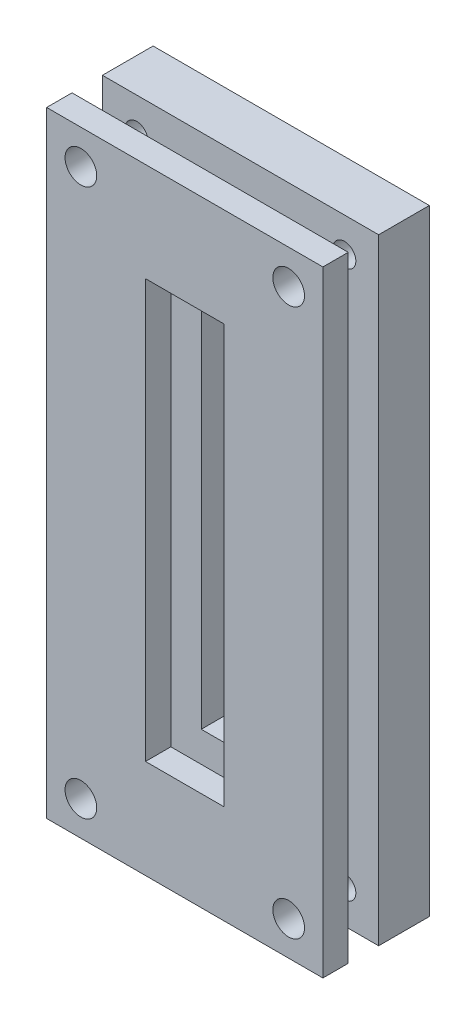
ISO-10303-21;
HEADER;
FILE_DESCRIPTION(('STEP AP214'),'2;1');
FILE_NAME('part.step','',(''),(''),'','','');
FILE_SCHEMA(('AUTOMOTIVE_DESIGN { 1 0 10303 214 1 1 1 1 }'));
ENDSEC;
DATA;
#1=APPLICATION_CONTEXT('core data for automotive mechanical design processes');
#2=APPLICATION_PROTOCOL_DEFINITION('international standard','automotive_design',2000,#1);
#3=PRODUCT_CONTEXT('',#1,'mechanical');
#4=PRODUCT('Part','Part','',(#3));
#5=PRODUCT_RELATED_PRODUCT_CATEGORY('part','',(#4));
#6=PRODUCT_DEFINITION_FORMATION('','',#4);
#7=PRODUCT_DEFINITION_CONTEXT('part definition',#1,'design');
#8=PRODUCT_DEFINITION('design','',#6,#7);
#9=PRODUCT_DEFINITION_SHAPE('','',#8);
#10=(LENGTH_UNIT() NAMED_UNIT(*) SI_UNIT(.MILLI.,.METRE.));
#11=(NAMED_UNIT(*) PLANE_ANGLE_UNIT() SI_UNIT($,.RADIAN.));
#12=(NAMED_UNIT(*) SI_UNIT($,.STERADIAN.) SOLID_ANGLE_UNIT());
#13=UNCERTAINTY_MEASURE_WITH_UNIT(LENGTH_MEASURE(1.E-05),#10,'distance_accuracy_value','');
#14=(GEOMETRIC_REPRESENTATION_CONTEXT(3) GLOBAL_UNCERTAINTY_ASSIGNED_CONTEXT((#13)) GLOBAL_UNIT_ASSIGNED_CONTEXT((#10,
#11,#12)) REPRESENTATION_CONTEXT('',''));
#15=CARTESIAN_POINT('',(0.,0.,0.));
#16=DIRECTION('',(0.,0.,1.));
#17=DIRECTION('',(1.,0.,0.));
#18=AXIS2_PLACEMENT_3D('',#15,#16,#17);
#19=CARTESIAN_POINT('',(0.,0.,8.9));
#20=DIRECTION('',(0.,0.,1.));
#21=DIRECTION('',(1.,0.,0.));
#22=AXIS2_PLACEMENT_3D('',#19,#20,#21);
#23=PLANE('',#22);
#24=CARTESIAN_POINT('',(-8.20000000000001,-21.6,8.9));
#25=DIRECTION('',(0.,0.,1.));
#26=DIRECTION('',(1.,0.,0.));
#27=AXIS2_PLACEMENT_3D('',#24,#25,#26);
#28=CIRCLE('',#27,1.25);
#29=CARTESIAN_POINT('',(-6.95000000000001,-21.6,8.9));
#30=VERTEX_POINT('',#29);
#31=EDGE_CURVE('E261',#30,#30,#28,.T.);
#32=ORIENTED_EDGE('',*,*,#31,.F.);
#33=EDGE_LOOP('',(#32));
#34=FACE_BOUND('',#33,.T.);
#35=CARTESIAN_POINT('',(-8.2,21.6,8.9));
#36=DIRECTION('',(0.,0.,1.));
#37=DIRECTION('',(1.,0.,0.));
#38=AXIS2_PLACEMENT_3D('',#35,#36,#37);
#39=CIRCLE('',#38,1.25);
#40=CARTESIAN_POINT('',(-6.95,21.6,8.9));
#41=VERTEX_POINT('',#40);
#42=EDGE_CURVE('E143',#41,#41,#39,.T.);
#43=ORIENTED_EDGE('',*,*,#42,.F.);
#44=EDGE_LOOP('',(#43));
#45=FACE_BOUND('',#44,.T.);
#46=DIRECTION('',(0.,-1.,0.));
#47=VECTOR('',#46,1.);
#48=CARTESIAN_POINT('',(-10.9,24.3,8.9));
#49=LINE('',#48,#47);
#50=CARTESIAN_POINT('',(-10.9,24.3,8.9));
#51=VERTEX_POINT('',#50);
#52=CARTESIAN_POINT('',(-10.9,-24.3,8.9));
#53=VERTEX_POINT('',#52);
#54=EDGE_CURVE('E153',#51,#53,#49,.T.);
#55=ORIENTED_EDGE('',*,*,#54,.T.);
#56=DIRECTION('',(1.,0.,0.));
#57=VECTOR('',#56,1.);
#58=CARTESIAN_POINT('',(-10.9,-24.3,8.9));
#59=LINE('',#58,#57);
#60=CARTESIAN_POINT('',(10.9,-24.3,8.9));
#61=VERTEX_POINT('',#60);
#62=EDGE_CURVE('E156',#53,#61,#59,.T.);
#63=ORIENTED_EDGE('',*,*,#62,.T.);
#64=DIRECTION('',(0.,1.,0.));
#65=VECTOR('',#64,1.);
#66=CARTESIAN_POINT('',(10.9,-24.3,8.9));
#67=LINE('',#66,#65);
#68=CARTESIAN_POINT('',(10.9,24.3,8.9));
#69=VERTEX_POINT('',#68);
#70=EDGE_CURVE('E159',#61,#69,#67,.T.);
#71=ORIENTED_EDGE('',*,*,#70,.T.);
#72=DIRECTION('',(-1.,0.,0.));
#73=VECTOR('',#72,1.);
#74=CARTESIAN_POINT('',(10.9,24.3,8.9));
#75=LINE('',#74,#73);
#76=EDGE_CURVE('E161',#69,#51,#75,.T.);
#77=ORIENTED_EDGE('',*,*,#76,.T.);
#78=EDGE_LOOP('',(#55,#63,#71,#77));
#79=FACE_BOUND('',#78,.T.);
#80=DIRECTION('',(0.,-1.,0.));
#81=VECTOR('',#80,1.);
#82=CARTESIAN_POINT('',(-3.1,16.5,8.9));
#83=LINE('',#82,#81);
#84=CARTESIAN_POINT('',(-3.1,16.5,8.9));
#85=VERTEX_POINT('',#84);
#86=CARTESIAN_POINT('',(-3.1,-16.5,8.9));
#87=VERTEX_POINT('',#86);
#88=EDGE_CURVE('E122',#85,#87,#83,.T.);
#89=ORIENTED_EDGE('',*,*,#88,.F.);
#90=DIRECTION('',(-1.,0.,0.));
#91=VECTOR('',#90,1.);
#92=CARTESIAN_POINT('',(3.1,16.5,8.9));
#93=LINE('',#92,#91);
#94=CARTESIAN_POINT('',(3.1,16.5,8.9));
#95=VERTEX_POINT('',#94);
#96=EDGE_CURVE('E114',#95,#85,#93,.T.);
#97=ORIENTED_EDGE('',*,*,#96,.F.);
#98=DIRECTION('',(0.,1.,0.));
#99=VECTOR('',#98,1.);
#100=CARTESIAN_POINT('',(3.1,-16.5,8.9));
#101=LINE('',#100,#99);
#102=CARTESIAN_POINT('',(3.1,-16.5,8.9));
#103=VERTEX_POINT('',#102);
#104=EDGE_CURVE('E137',#103,#95,#101,.T.);
#105=ORIENTED_EDGE('',*,*,#104,.F.);
#106=DIRECTION('',(1.,0.,0.));
#107=VECTOR('',#106,1.);
#108=CARTESIAN_POINT('',(-3.1,-16.5,8.9));
#109=LINE('',#108,#107);
#110=EDGE_CURVE('E135',#87,#103,#109,.T.);
#111=ORIENTED_EDGE('',*,*,#110,.F.);
#112=EDGE_LOOP('',(#89,#97,#105,#111));
#113=FACE_BOUND('',#112,.T.);
#114=CARTESIAN_POINT('',(8.2,21.6,8.9));
#115=DIRECTION('',(0.,0.,1.));
#116=DIRECTION('',(1.,0.,0.));
#117=AXIS2_PLACEMENT_3D('',#114,#115,#116);
#118=CIRCLE('',#117,1.25);
#119=CARTESIAN_POINT('',(9.45,21.6,8.9));
#120=VERTEX_POINT('',#119);
#121=EDGE_CURVE('E267',#120,#120,#118,.T.);
#122=ORIENTED_EDGE('',*,*,#121,.F.);
#123=EDGE_LOOP('',(#122));
#124=FACE_BOUND('',#123,.T.);
#125=CARTESIAN_POINT('',(8.19999999999999,-21.6,8.9));
#126=DIRECTION('',(0.,0.,1.));
#127=DIRECTION('',(1.,0.,0.));
#128=AXIS2_PLACEMENT_3D('',#125,#126,#127);
#129=CIRCLE('',#128,1.25);
#130=CARTESIAN_POINT('',(9.44999999999999,-21.6,8.9));
#131=VERTEX_POINT('',#130);
#132=EDGE_CURVE('E252',#131,#131,#129,.T.);
#133=ORIENTED_EDGE('',*,*,#132,.F.);
#134=EDGE_LOOP('',(#133));
#135=FACE_BOUND('',#134,.T.);
#136=ADVANCED_FACE('F49',(#34,#45,#79,#113,#124,#135),#23,.T.);
#137=CARTESIAN_POINT('',(0.,0.,6.9));
#138=DIRECTION('',(0.,0.,1.));
#139=DIRECTION('',(1.,0.,0.));
#140=AXIS2_PLACEMENT_3D('',#137,#138,#139);
#141=PLANE('',#140);
#142=DIRECTION('',(0.,-1.,0.));
#143=VECTOR('',#142,1.);
#144=CARTESIAN_POINT('',(-10.9,24.3,6.9));
#145=LINE('',#144,#143);
#146=CARTESIAN_POINT('',(-10.9,24.3,6.9));
#147=VERTEX_POINT('',#146);
#148=CARTESIAN_POINT('',(-10.9,-24.3,6.9));
#149=VERTEX_POINT('',#148);
#150=EDGE_CURVE('E130',#147,#149,#145,.T.);
#151=ORIENTED_EDGE('',*,*,#150,.F.);
#152=DIRECTION('',(-1.,0.,0.));
#153=VECTOR('',#152,1.);
#154=CARTESIAN_POINT('',(10.9,24.3,6.9));
#155=LINE('',#154,#153);
#156=CARTESIAN_POINT('',(10.9,24.3,6.9));
#157=VERTEX_POINT('',#156);
#158=EDGE_CURVE('E157',#157,#147,#155,.T.);
#159=ORIENTED_EDGE('',*,*,#158,.F.);
#160=DIRECTION('',(0.,1.,0.));
#161=VECTOR('',#160,1.);
#162=CARTESIAN_POINT('',(10.9,-24.3,6.9));
#163=LINE('',#162,#161);
#164=CARTESIAN_POINT('',(10.9,-24.3,6.9));
#165=VERTEX_POINT('',#164);
#166=EDGE_CURVE('E168',#165,#157,#163,.T.);
#167=ORIENTED_EDGE('',*,*,#166,.F.);
#168=DIRECTION('',(1.,0.,0.));
#169=VECTOR('',#168,1.);
#170=CARTESIAN_POINT('',(-10.9,-24.3,6.9));
#171=LINE('',#170,#169);
#172=EDGE_CURVE('E166',#149,#165,#171,.T.);
#173=ORIENTED_EDGE('',*,*,#172,.F.);
#174=EDGE_LOOP('',(#151,#159,#167,#173));
#175=FACE_BOUND('',#174,.T.);
#176=DIRECTION('',(-1.,0.,0.));
#177=VECTOR('',#176,1.);
#178=CARTESIAN_POINT('',(3.1,16.5,6.9));
#179=LINE('',#178,#177);
#180=CARTESIAN_POINT('',(3.1,16.5,6.9));
#181=VERTEX_POINT('',#180);
#182=CARTESIAN_POINT('',(-3.1,16.5,6.9));
#183=VERTEX_POINT('',#182);
#184=EDGE_CURVE('E72',#181,#183,#179,.T.);
#185=ORIENTED_EDGE('',*,*,#184,.T.);
#186=DIRECTION('',(0.,-1.,0.));
#187=VECTOR('',#186,1.);
#188=CARTESIAN_POINT('',(-3.1,16.5,6.9));
#189=LINE('',#188,#187);
#190=CARTESIAN_POINT('',(-3.1,-16.5,6.9));
#191=VERTEX_POINT('',#190);
#192=EDGE_CURVE('E129',#183,#191,#189,.T.);
#193=ORIENTED_EDGE('',*,*,#192,.T.);
#194=DIRECTION('',(1.,0.,0.));
#195=VECTOR('',#194,1.);
#196=CARTESIAN_POINT('',(-3.1,-16.5,6.9));
#197=LINE('',#196,#195);
#198=CARTESIAN_POINT('',(3.1,-16.5,6.9));
#199=VERTEX_POINT('',#198);
#200=EDGE_CURVE('E145',#191,#199,#197,.T.);
#201=ORIENTED_EDGE('',*,*,#200,.T.);
#202=DIRECTION('',(0.,1.,0.));
#203=VECTOR('',#202,1.);
#204=CARTESIAN_POINT('',(3.1,-16.5,6.9));
#205=LINE('',#204,#203);
#206=EDGE_CURVE('E123',#199,#181,#205,.T.);
#207=ORIENTED_EDGE('',*,*,#206,.T.);
#208=EDGE_LOOP('',(#185,#193,#201,#207));
#209=FACE_BOUND('',#208,.T.);
#210=CARTESIAN_POINT('',(-8.2,21.6,6.9));
#211=DIRECTION('',(0.,0.,1.));
#212=DIRECTION('',(1.,0.,0.));
#213=AXIS2_PLACEMENT_3D('',#210,#211,#212);
#214=CIRCLE('',#213,1.25);
#215=CARTESIAN_POINT('',(-6.95,21.6,6.9));
#216=VERTEX_POINT('',#215);
#217=EDGE_CURVE('E270',#216,#216,#214,.T.);
#218=ORIENTED_EDGE('',*,*,#217,.T.);
#219=EDGE_LOOP('',(#218));
#220=FACE_BOUND('',#219,.T.);
#221=CARTESIAN_POINT('',(8.2,21.6,6.9));
#222=DIRECTION('',(0.,0.,1.));
#223=DIRECTION('',(1.,0.,0.));
#224=AXIS2_PLACEMENT_3D('',#221,#222,#223);
#225=CIRCLE('',#224,1.25);
#226=CARTESIAN_POINT('',(9.45,21.6,6.9));
#227=VERTEX_POINT('',#226);
#228=EDGE_CURVE('E264',#227,#227,#225,.T.);
#229=ORIENTED_EDGE('',*,*,#228,.T.);
#230=EDGE_LOOP('',(#229));
#231=FACE_BOUND('',#230,.T.);
#232=CARTESIAN_POINT('',(-8.20000000000001,-21.6,6.9));
#233=DIRECTION('',(0.,0.,1.));
#234=DIRECTION('',(1.,0.,0.));
#235=AXIS2_PLACEMENT_3D('',#232,#233,#234);
#236=CIRCLE('',#235,1.25);
#237=CARTESIAN_POINT('',(-6.95000000000001,-21.6,6.9));
#238=VERTEX_POINT('',#237);
#239=EDGE_CURVE('E258',#238,#238,#236,.T.);
#240=ORIENTED_EDGE('',*,*,#239,.T.);
#241=EDGE_LOOP('',(#240));
#242=FACE_BOUND('',#241,.T.);
#243=CARTESIAN_POINT('',(8.19999999999999,-21.6,6.9));
#244=DIRECTION('',(0.,0.,1.));
#245=DIRECTION('',(1.,0.,0.));
#246=AXIS2_PLACEMENT_3D('',#243,#244,#245);
#247=CIRCLE('',#246,1.25);
#248=CARTESIAN_POINT('',(9.44999999999999,-21.6,6.9));
#249=VERTEX_POINT('',#248);
#250=EDGE_CURVE('E255',#249,#249,#247,.T.);
#251=ORIENTED_EDGE('',*,*,#250,.T.);
#252=EDGE_LOOP('',(#251));
#253=FACE_BOUND('',#252,.T.);
#254=ADVANCED_FACE('F186',(#175,#209,#220,#231,#242,#253),#141,.F.);
#255=CARTESIAN_POINT('',(-10.9,24.3,8.9));
#256=DIRECTION('',(1.,0.,0.));
#257=DIRECTION('',(0.,1.,0.));
#258=AXIS2_PLACEMENT_3D('',#255,#256,#257);
#259=PLANE('',#258);
#260=ORIENTED_EDGE('',*,*,#150,.T.);
#261=DIRECTION('',(0.,0.,-1.));
#262=VECTOR('',#261,1.);
#263=CARTESIAN_POINT('',(-10.9,-24.3,8.9));
#264=LINE('',#263,#262);
#265=EDGE_CURVE('E12',#53,#149,#264,.T.);
#266=ORIENTED_EDGE('',*,*,#265,.F.);
#267=ORIENTED_EDGE('',*,*,#54,.F.);
#268=DIRECTION('',(0.,0.,-1.));
#269=VECTOR('',#268,1.);
#270=CARTESIAN_POINT('',(-10.9,24.3,8.9));
#271=LINE('',#270,#269);
#272=EDGE_CURVE('E163',#51,#147,#271,.T.);
#273=ORIENTED_EDGE('',*,*,#272,.T.);
#274=EDGE_LOOP('',(#260,#266,#267,#273));
#275=FACE_BOUND('',#274,.T.);
#276=ADVANCED_FACE('F51',(#275),#259,.F.);
#277=CARTESIAN_POINT('',(-10.9,-24.3,8.9));
#278=DIRECTION('',(0.,1.,0.));
#279=DIRECTION('',(0.,0.,1.));
#280=AXIS2_PLACEMENT_3D('',#277,#278,#279);
#281=PLANE('',#280);
#282=ORIENTED_EDGE('',*,*,#172,.T.);
#283=DIRECTION('',(0.,0.,-1.));
#284=VECTOR('',#283,1.);
#285=CARTESIAN_POINT('',(10.9,-24.3,8.9));
#286=LINE('',#285,#284);
#287=EDGE_CURVE('E57',#61,#165,#286,.T.);
#288=ORIENTED_EDGE('',*,*,#287,.F.);
#289=ORIENTED_EDGE('',*,*,#62,.F.);
#290=ORIENTED_EDGE('',*,*,#265,.T.);
#291=EDGE_LOOP('',(#282,#288,#289,#290));
#292=FACE_BOUND('',#291,.T.);
#293=ADVANCED_FACE('F196',(#292),#281,.F.);
#294=CARTESIAN_POINT('',(10.9,-24.3,8.9));
#295=DIRECTION('',(-1.,0.,0.));
#296=DIRECTION('',(0.,0.,1.));
#297=AXIS2_PLACEMENT_3D('',#294,#295,#296);
#298=PLANE('',#297);
#299=ORIENTED_EDGE('',*,*,#166,.T.);
#300=DIRECTION('',(0.,0.,-1.));
#301=VECTOR('',#300,1.);
#302=CARTESIAN_POINT('',(10.9,24.3,8.9));
#303=LINE('',#302,#301);
#304=EDGE_CURVE('E173',#69,#157,#303,.T.);
#305=ORIENTED_EDGE('',*,*,#304,.F.);
#306=ORIENTED_EDGE('',*,*,#70,.F.);
#307=ORIENTED_EDGE('',*,*,#287,.T.);
#308=EDGE_LOOP('',(#299,#305,#306,#307));
#309=FACE_BOUND('',#308,.T.);
#310=ADVANCED_FACE('F180',(#309),#298,.F.);
#311=CARTESIAN_POINT('',(10.9,24.3,8.9));
#312=DIRECTION('',(0.,-1.,0.));
#313=DIRECTION('',(1.,0.,0.));
#314=AXIS2_PLACEMENT_3D('',#311,#312,#313);
#315=PLANE('',#314);
#316=ORIENTED_EDGE('',*,*,#158,.T.);
#317=ORIENTED_EDGE('',*,*,#272,.F.);
#318=ORIENTED_EDGE('',*,*,#76,.F.);
#319=ORIENTED_EDGE('',*,*,#304,.T.);
#320=EDGE_LOOP('',(#316,#317,#318,#319));
#321=FACE_BOUND('',#320,.T.);
#322=ADVANCED_FACE('F190',(#321),#315,.F.);
#323=CARTESIAN_POINT('',(3.1,16.5,8.9));
#324=DIRECTION('',(0.,-1.,0.));
#325=DIRECTION('',(0.,0.,-1.));
#326=AXIS2_PLACEMENT_3D('',#323,#324,#325);
#327=PLANE('',#326);
#328=ORIENTED_EDGE('',*,*,#184,.F.);
#329=DIRECTION('',(0.,0.,-1.));
#330=VECTOR('',#329,1.);
#331=CARTESIAN_POINT('',(3.1,16.5,8.9));
#332=LINE('',#331,#330);
#333=EDGE_CURVE('E118',#95,#181,#332,.T.);
#334=ORIENTED_EDGE('',*,*,#333,.F.);
#335=ORIENTED_EDGE('',*,*,#96,.T.);
#336=DIRECTION('',(0.,0.,-1.));
#337=VECTOR('',#336,1.);
#338=CARTESIAN_POINT('',(-3.1,16.5,8.9));
#339=LINE('',#338,#337);
#340=EDGE_CURVE('E117',#85,#183,#339,.T.);
#341=ORIENTED_EDGE('',*,*,#340,.T.);
#342=EDGE_LOOP('',(#328,#334,#335,#341));
#343=FACE_BOUND('',#342,.T.);
#344=ADVANCED_FACE('F116',(#343),#327,.T.);
#345=CARTESIAN_POINT('',(-3.1,16.5,8.9));
#346=DIRECTION('',(1.,0.,0.));
#347=DIRECTION('',(0.,1.,0.));
#348=AXIS2_PLACEMENT_3D('',#345,#346,#347);
#349=PLANE('',#348);
#350=ORIENTED_EDGE('',*,*,#192,.F.);
#351=ORIENTED_EDGE('',*,*,#340,.F.);
#352=ORIENTED_EDGE('',*,*,#88,.T.);
#353=DIRECTION('',(0.,0.,-1.));
#354=VECTOR('',#353,1.);
#355=CARTESIAN_POINT('',(-3.1,-16.5,8.9));
#356=LINE('',#355,#354);
#357=EDGE_CURVE('E131',#87,#191,#356,.T.);
#358=ORIENTED_EDGE('',*,*,#357,.T.);
#359=EDGE_LOOP('',(#350,#351,#352,#358));
#360=FACE_BOUND('',#359,.T.);
#361=ADVANCED_FACE('F126',(#360),#349,.T.);
#362=CARTESIAN_POINT('',(-3.1,-16.5,8.9));
#363=DIRECTION('',(0.,1.,0.));
#364=DIRECTION('',(0.,0.,1.));
#365=AXIS2_PLACEMENT_3D('',#362,#363,#364);
#366=PLANE('',#365);
#367=ORIENTED_EDGE('',*,*,#200,.F.);
#368=ORIENTED_EDGE('',*,*,#357,.F.);
#369=ORIENTED_EDGE('',*,*,#110,.T.);
#370=DIRECTION('',(0.,0.,-1.));
#371=VECTOR('',#370,1.);
#372=CARTESIAN_POINT('',(3.1,-16.5,8.9));
#373=LINE('',#372,#371);
#374=EDGE_CURVE('E64',#103,#199,#373,.T.);
#375=ORIENTED_EDGE('',*,*,#374,.T.);
#376=EDGE_LOOP('',(#367,#368,#369,#375));
#377=FACE_BOUND('',#376,.T.);
#378=ADVANCED_FACE('F222',(#377),#366,.T.);
#379=CARTESIAN_POINT('',(3.1,-16.5,8.9));
#380=DIRECTION('',(-1.,0.,0.));
#381=DIRECTION('',(0.,-1.,0.));
#382=AXIS2_PLACEMENT_3D('',#379,#380,#381);
#383=PLANE('',#382);
#384=ORIENTED_EDGE('',*,*,#206,.F.);
#385=ORIENTED_EDGE('',*,*,#374,.F.);
#386=ORIENTED_EDGE('',*,*,#104,.T.);
#387=ORIENTED_EDGE('',*,*,#333,.T.);
#388=EDGE_LOOP('',(#384,#385,#386,#387));
#389=FACE_BOUND('',#388,.T.);
#390=ADVANCED_FACE('F226',(#389),#383,.T.);
#391=CARTESIAN_POINT('',(-8.2,21.6,8.9));
#392=DIRECTION('',(0.,0.,-1.));
#393=DIRECTION('',(-1.,0.,0.));
#394=AXIS2_PLACEMENT_3D('',#391,#392,#393);
#395=CYLINDRICAL_SURFACE('',#394,1.25);
#396=ORIENTED_EDGE('',*,*,#42,.T.);
#397=EDGE_LOOP('',(#396));
#398=FACE_BOUND('',#397,.T.);
#399=ORIENTED_EDGE('',*,*,#217,.F.);
#400=EDGE_LOOP('',(#399));
#401=FACE_BOUND('',#400,.T.);
#402=ADVANCED_FACE('F232',(#398,#401),#395,.F.);
#403=CARTESIAN_POINT('',(8.2,21.6,8.9));
#404=DIRECTION('',(0.,0.,-1.));
#405=DIRECTION('',(-1.,0.,0.));
#406=AXIS2_PLACEMENT_3D('',#403,#404,#405);
#407=CYLINDRICAL_SURFACE('',#406,1.25);
#408=ORIENTED_EDGE('',*,*,#121,.T.);
#409=EDGE_LOOP('',(#408));
#410=FACE_BOUND('',#409,.T.);
#411=ORIENTED_EDGE('',*,*,#228,.F.);
#412=EDGE_LOOP('',(#411));
#413=FACE_BOUND('',#412,.T.);
#414=ADVANCED_FACE('F235',(#410,#413),#407,.F.);
#415=CARTESIAN_POINT('',(-8.20000000000001,-21.6,8.9));
#416=DIRECTION('',(0.,0.,-1.));
#417=DIRECTION('',(-1.,0.,0.));
#418=AXIS2_PLACEMENT_3D('',#415,#416,#417);
#419=CYLINDRICAL_SURFACE('',#418,1.25);
#420=ORIENTED_EDGE('',*,*,#31,.T.);
#421=EDGE_LOOP('',(#420));
#422=FACE_BOUND('',#421,.T.);
#423=ORIENTED_EDGE('',*,*,#239,.F.);
#424=EDGE_LOOP('',(#423));
#425=FACE_BOUND('',#424,.T.);
#426=ADVANCED_FACE('F239',(#422,#425),#419,.F.);
#427=CARTESIAN_POINT('',(8.19999999999999,-21.6,8.9));
#428=DIRECTION('',(0.,0.,-1.));
#429=DIRECTION('',(-1.,0.,0.));
#430=AXIS2_PLACEMENT_3D('',#427,#428,#429);
#431=CYLINDRICAL_SURFACE('',#430,1.25);
#432=ORIENTED_EDGE('',*,*,#132,.T.);
#433=EDGE_LOOP('',(#432));
#434=FACE_BOUND('',#433,.T.);
#435=ORIENTED_EDGE('',*,*,#250,.F.);
#436=EDGE_LOOP('',(#435));
#437=FACE_BOUND('',#436,.T.);
#438=ADVANCED_FACE('F243',(#434,#437),#431,.F.);
#439=CLOSED_SHELL('',(#136,#254,#276,#293,#310,#322,#344,#361,#378,#390,#402,#414,#426,#438));
#440=MANIFOLD_SOLID_BREP('B2',#439);
#441=CARTESIAN_POINT('',(5.5,16.5,4.5));
#442=DIRECTION('',(-1.,0.,0.));
#443=DIRECTION('',(0.,-1.,0.));
#444=AXIS2_PLACEMENT_3D('',#441,#442,#443);
#445=PLANE('',#444);
#446=DIRECTION('',(0.,1.,0.));
#447=VECTOR('',#446,1.);
#448=CARTESIAN_POINT('',(5.5,-18.9,0.5));
#449=LINE('',#448,#447);
#450=CARTESIAN_POINT('',(5.5,-18.9,0.5));
#451=VERTEX_POINT('',#450);
#452=CARTESIAN_POINT('',(5.5,18.9,0.5));
#453=VERTEX_POINT('',#452);
#454=EDGE_CURVE('E467',#451,#453,#449,.T.);
#455=ORIENTED_EDGE('',*,*,#454,.F.);
#456=DIRECTION('',(0.,0.,-1.));
#457=VECTOR('',#456,1.);
#458=CARTESIAN_POINT('',(5.5,-18.9,4.5));
#459=LINE('',#458,#457);
#460=CARTESIAN_POINT('',(5.5,-18.9,0.));
#461=VERTEX_POINT('',#460);
#462=EDGE_CURVE('E454',#451,#461,#459,.T.);
#463=ORIENTED_EDGE('',*,*,#462,.T.);
#464=DIRECTION('',(0.,1.,0.));
#465=VECTOR('',#464,1.);
#466=CARTESIAN_POINT('',(5.5,16.5,0.));
#467=LINE('',#466,#465);
#468=CARTESIAN_POINT('',(5.5,18.9,0.));
#469=VERTEX_POINT('',#468);
#470=EDGE_CURVE('E572',#461,#469,#467,.T.);
#471=ORIENTED_EDGE('',*,*,#470,.T.);
#472=DIRECTION('',(0.,0.,-1.));
#473=VECTOR('',#472,1.);
#474=CARTESIAN_POINT('',(5.5,18.9,4.5));
#475=LINE('',#474,#473);
#476=EDGE_CURVE('E47',#453,#469,#475,.T.);
#477=ORIENTED_EDGE('',*,*,#476,.F.);
#478=EDGE_LOOP('',(#455,#463,#471,#477));
#479=FACE_BOUND('',#478,.T.);
#480=ADVANCED_FACE('F363',(#479),#445,.F.);
#481=CARTESIAN_POINT('',(-3.1,18.9,4.5));
#482=DIRECTION('',(0.,-1.,0.));
#483=DIRECTION('',(0.,0.,-1.));
#484=AXIS2_PLACEMENT_3D('',#481,#482,#483);
#485=PLANE('',#484);
#486=DIRECTION('',(-1.,0.,0.));
#487=VECTOR('',#486,1.);
#488=CARTESIAN_POINT('',(5.5,18.9,0.5));
#489=LINE('',#488,#487);
#490=CARTESIAN_POINT('',(-5.5,18.9,0.5));
#491=VERTEX_POINT('',#490);
#492=EDGE_CURVE('E380',#453,#491,#489,.T.);
#493=ORIENTED_EDGE('',*,*,#492,.F.);
#494=ORIENTED_EDGE('',*,*,#476,.T.);
#495=DIRECTION('',(-1.,0.,0.));
#496=VECTOR('',#495,1.);
#497=CARTESIAN_POINT('',(-3.1,18.9,0.));
#498=LINE('',#497,#496);
#499=CARTESIAN_POINT('',(-5.5,18.9,0.));
#500=VERTEX_POINT('',#499);
#501=EDGE_CURVE('E367',#469,#500,#498,.T.);
#502=ORIENTED_EDGE('',*,*,#501,.T.);
#503=DIRECTION('',(0.,0.,-1.));
#504=VECTOR('',#503,1.);
#505=CARTESIAN_POINT('',(-5.5,18.9,4.5));
#506=LINE('',#505,#504);
#507=EDGE_CURVE('E373',#491,#500,#506,.T.);
#508=ORIENTED_EDGE('',*,*,#507,.F.);
#509=EDGE_LOOP('',(#493,#494,#502,#508));
#510=FACE_BOUND('',#509,.T.);
#511=ADVANCED_FACE('F588',(#510),#485,.F.);
#512=CARTESIAN_POINT('',(-5.5,16.5,4.5));
#513=DIRECTION('',(1.,0.,0.));
#514=DIRECTION('',(0.,1.,0.));
#515=AXIS2_PLACEMENT_3D('',#512,#513,#514);
#516=PLANE('',#515);
#517=DIRECTION('',(0.,-1.,0.));
#518=VECTOR('',#517,1.);
#519=CARTESIAN_POINT('',(-5.5,18.9,0.5));
#520=LINE('',#519,#518);
#521=CARTESIAN_POINT('',(-5.5,-18.9,0.5));
#522=VERTEX_POINT('',#521);
#523=EDGE_CURVE('E388',#491,#522,#520,.T.);
#524=ORIENTED_EDGE('',*,*,#523,.F.);
#525=ORIENTED_EDGE('',*,*,#507,.T.);
#526=DIRECTION('',(0.,-1.,0.));
#527=VECTOR('',#526,1.);
#528=CARTESIAN_POINT('',(-5.5,16.5,0.));
#529=LINE('',#528,#527);
#530=CARTESIAN_POINT('',(-5.5,-18.9,0.));
#531=VERTEX_POINT('',#530);
#532=EDGE_CURVE('E581',#500,#531,#529,.T.);
#533=ORIENTED_EDGE('',*,*,#532,.T.);
#534=DIRECTION('',(0.,0.,-1.));
#535=VECTOR('',#534,1.);
#536=CARTESIAN_POINT('',(-5.5,-18.9,4.5));
#537=LINE('',#536,#535);
#538=EDGE_CURVE('E464',#522,#531,#537,.T.);
#539=ORIENTED_EDGE('',*,*,#538,.F.);
#540=EDGE_LOOP('',(#524,#525,#533,#539));
#541=FACE_BOUND('',#540,.T.);
#542=ADVANCED_FACE('F610',(#541),#516,.F.);
#543=CARTESIAN_POINT('',(-3.1,-18.9,4.5));
#544=DIRECTION('',(0.,1.,0.));
#545=DIRECTION('',(0.,0.,1.));
#546=AXIS2_PLACEMENT_3D('',#543,#544,#545);
#547=PLANE('',#546);
#548=DIRECTION('',(1.,0.,0.));
#549=VECTOR('',#548,1.);
#550=CARTESIAN_POINT('',(-5.5,-18.9,0.5));
#551=LINE('',#550,#549);
#552=EDGE_CURVE('E457',#522,#451,#551,.T.);
#553=ORIENTED_EDGE('',*,*,#552,.F.);
#554=ORIENTED_EDGE('',*,*,#538,.T.);
#555=DIRECTION('',(1.,0.,0.));
#556=VECTOR('',#555,1.);
#557=CARTESIAN_POINT('',(-3.1,-18.9,0.));
#558=LINE('',#557,#556);
#559=EDGE_CURVE('E459',#531,#461,#558,.T.);
#560=ORIENTED_EDGE('',*,*,#559,.T.);
#561=ORIENTED_EDGE('',*,*,#462,.F.);
#562=EDGE_LOOP('',(#553,#554,#560,#561));
#563=FACE_BOUND('',#562,.T.);
#564=ADVANCED_FACE('F365',(#563),#547,.F.);
#565=CARTESIAN_POINT('',(0.,0.,4.5));
#566=DIRECTION('',(0.,0.,1.));
#567=DIRECTION('',(1.,0.,0.));
#568=AXIS2_PLACEMENT_3D('',#565,#566,#567);
#569=PLANE('',#568);
#570=DIRECTION('',(0.,1.,0.));
#571=VECTOR('',#570,1.);
#572=CARTESIAN_POINT('',(3.1,16.5,4.5));
#573=LINE('',#572,#571);
#574=CARTESIAN_POINT('',(3.1,-16.5,4.5));
#575=VERTEX_POINT('',#574);
#576=CARTESIAN_POINT('',(3.1,16.5,4.5));
#577=VERTEX_POINT('',#576);
#578=EDGE_CURVE('E531',#575,#577,#573,.T.);
#579=ORIENTED_EDGE('',*,*,#578,.F.);
#580=DIRECTION('',(1.,0.,0.));
#581=VECTOR('',#580,1.);
#582=CARTESIAN_POINT('',(-3.1,-16.5,4.5));
#583=LINE('',#582,#581);
#584=CARTESIAN_POINT('',(-3.1,-16.5,4.5));
#585=VERTEX_POINT('',#584);
#586=EDGE_CURVE('E542',#585,#575,#583,.T.);
#587=ORIENTED_EDGE('',*,*,#586,.F.);
#588=DIRECTION('',(0.,-1.,0.));
#589=VECTOR('',#588,1.);
#590=CARTESIAN_POINT('',(-3.1,16.5,4.5));
#591=LINE('',#590,#589);
#592=CARTESIAN_POINT('',(-3.1,16.5,4.5));
#593=VERTEX_POINT('',#592);
#594=EDGE_CURVE('E538',#593,#585,#591,.T.);
#595=ORIENTED_EDGE('',*,*,#594,.F.);
#596=DIRECTION('',(-1.,0.,0.));
#597=VECTOR('',#596,1.);
#598=CARTESIAN_POINT('',(-3.1,16.5,4.5));
#599=LINE('',#598,#597);
#600=EDGE_CURVE('E534',#577,#593,#599,.T.);
#601=ORIENTED_EDGE('',*,*,#600,.F.);
#602=EDGE_LOOP('',(#579,#587,#595,#601));
#603=FACE_BOUND('',#602,.T.);
#604=CARTESIAN_POINT('',(-8.20000000000001,-21.6,4.5));
#605=DIRECTION('',(0.,0.,1.));
#606=DIRECTION('',(-1.,0.,0.));
#607=AXIS2_PLACEMENT_3D('',#604,#605,#606);
#608=CIRCLE('',#607,0.899999999999999);
#609=CARTESIAN_POINT('',(-9.10000000000001,-21.6,4.5));
#610=VERTEX_POINT('',#609);
#611=EDGE_CURVE('E745',#610,#610,#608,.T.);
#612=ORIENTED_EDGE('',*,*,#611,.F.);
#613=EDGE_LOOP('',(#612));
#614=FACE_BOUND('',#613,.T.);
#615=CARTESIAN_POINT('',(8.19999999999999,-21.6,4.5));
#616=DIRECTION('',(0.,0.,1.));
#617=DIRECTION('',(-1.,0.,0.));
#618=AXIS2_PLACEMENT_3D('',#615,#616,#617);
#619=CIRCLE('',#618,0.900000000000001);
#620=CARTESIAN_POINT('',(7.29999999999999,-21.6,4.5));
#621=VERTEX_POINT('',#620);
#622=EDGE_CURVE('E749',#621,#621,#619,.T.);
#623=ORIENTED_EDGE('',*,*,#622,.F.);
#624=EDGE_LOOP('',(#623));
#625=FACE_BOUND('',#624,.T.);
#626=CARTESIAN_POINT('',(8.2,21.6,4.5));
#627=DIRECTION('',(0.,0.,1.));
#628=DIRECTION('',(1.,0.,0.));
#629=AXIS2_PLACEMENT_3D('',#626,#627,#628);
#630=CIRCLE('',#629,0.900000000000001);
#631=CARTESIAN_POINT('',(9.1,21.6,4.5));
#632=VERTEX_POINT('',#631);
#633=EDGE_CURVE('E753',#632,#632,#630,.T.);
#634=ORIENTED_EDGE('',*,*,#633,.F.);
#635=EDGE_LOOP('',(#634));
#636=FACE_BOUND('',#635,.T.);
#637=CARTESIAN_POINT('',(-8.2,21.6,4.5));
#638=DIRECTION('',(0.,0.,1.));
#639=DIRECTION('',(1.,0.,0.));
#640=AXIS2_PLACEMENT_3D('',#637,#638,#639);
#641=CIRCLE('',#640,0.9);
#642=CARTESIAN_POINT('',(-7.3,21.6,4.5));
#643=VERTEX_POINT('',#642);
#644=EDGE_CURVE('E478',#643,#643,#641,.T.);
#645=ORIENTED_EDGE('',*,*,#644,.F.);
#646=EDGE_LOOP('',(#645));
#647=FACE_BOUND('',#646,.T.);
#648=DIRECTION('',(1.,0.,0.));
#649=VECTOR('',#648,1.);
#650=CARTESIAN_POINT('',(-10.9,-24.3,4.5));
#651=LINE('',#650,#649);
#652=CARTESIAN_POINT('',(-10.9,-24.3,4.5));
#653=VERTEX_POINT('',#652);
#654=CARTESIAN_POINT('',(10.9,-24.3,4.5));
#655=VERTEX_POINT('',#654);
#656=EDGE_CURVE('E486',#653,#655,#651,.T.);
#657=ORIENTED_EDGE('',*,*,#656,.T.);
#658=DIRECTION('',(0.,1.,0.));
#659=VECTOR('',#658,1.);
#660=CARTESIAN_POINT('',(10.9,-24.3,4.5));
#661=LINE('',#660,#659);
#662=CARTESIAN_POINT('',(10.9,24.3,4.5));
#663=VERTEX_POINT('',#662);
#664=EDGE_CURVE('E508',#655,#663,#661,.T.);
#665=ORIENTED_EDGE('',*,*,#664,.T.);
#666=DIRECTION('',(-1.,0.,0.));
#667=VECTOR('',#666,1.);
#668=CARTESIAN_POINT('',(10.9,24.3,4.5));
#669=LINE('',#668,#667);
#670=CARTESIAN_POINT('',(-10.9,24.3,4.5));
#671=VERTEX_POINT('',#670);
#672=EDGE_CURVE('E512',#663,#671,#669,.T.);
#673=ORIENTED_EDGE('',*,*,#672,.T.);
#674=DIRECTION('',(0.,-1.,0.));
#675=VECTOR('',#674,1.);
#676=CARTESIAN_POINT('',(-10.9,24.3,4.5));
#677=LINE('',#676,#675);
#678=EDGE_CURVE('E492',#671,#653,#677,.T.);
#679=ORIENTED_EDGE('',*,*,#678,.T.);
#680=EDGE_LOOP('',(#657,#665,#673,#679));
#681=FACE_BOUND('',#680,.T.);
#682=ADVANCED_FACE('F593',(#603,#614,#625,#636,#647,#681),#569,.T.);
#683=CARTESIAN_POINT('',(0.,0.,0.));
#684=DIRECTION('',(0.,0.,1.));
#685=DIRECTION('',(1.,0.,0.));
#686=AXIS2_PLACEMENT_3D('',#683,#684,#685);
#687=PLANE('',#686);
#688=DIRECTION('',(1.,0.,0.));
#689=VECTOR('',#688,1.);
#690=CARTESIAN_POINT('',(-3.1,-16.5,0.));
#691=LINE('',#690,#689);
#692=CARTESIAN_POINT('',(-3.1,-16.5,0.));
#693=VERTEX_POINT('',#692);
#694=CARTESIAN_POINT('',(3.1,-16.5,0.));
#695=VERTEX_POINT('',#694);
#696=EDGE_CURVE('E535',#693,#695,#691,.T.);
#697=ORIENTED_EDGE('',*,*,#696,.T.);
#698=DIRECTION('',(0.,1.,0.));
#699=VECTOR('',#698,1.);
#700=CARTESIAN_POINT('',(3.1,16.5,0.));
#701=LINE('',#700,#699);
#702=CARTESIAN_POINT('',(3.1,16.5,0.));
#703=VERTEX_POINT('',#702);
#704=EDGE_CURVE('E522',#695,#703,#701,.T.);
#705=ORIENTED_EDGE('',*,*,#704,.T.);
#706=DIRECTION('',(-1.,0.,0.));
#707=VECTOR('',#706,1.);
#708=CARTESIAN_POINT('',(-3.1,16.5,0.));
#709=LINE('',#708,#707);
#710=CARTESIAN_POINT('',(-3.1,16.5,0.));
#711=VERTEX_POINT('',#710);
#712=EDGE_CURVE('E549',#703,#711,#709,.T.);
#713=ORIENTED_EDGE('',*,*,#712,.T.);
#714=DIRECTION('',(0.,-1.,0.));
#715=VECTOR('',#714,1.);
#716=CARTESIAN_POINT('',(-3.1,16.5,0.));
#717=LINE('',#716,#715);
#718=EDGE_CURVE('E553',#711,#693,#717,.T.);
#719=ORIENTED_EDGE('',*,*,#718,.T.);
#720=EDGE_LOOP('',(#697,#705,#713,#719));
#721=FACE_BOUND('',#720,.T.);
#722=ORIENTED_EDGE('',*,*,#470,.F.);
#723=ORIENTED_EDGE('',*,*,#559,.F.);
#724=ORIENTED_EDGE('',*,*,#532,.F.);
#725=ORIENTED_EDGE('',*,*,#501,.F.);
#726=EDGE_LOOP('',(#722,#723,#724,#725));
#727=FACE_BOUND('',#726,.T.);
#728=ADVANCED_FACE('F590',(#721,#727),#687,.F.);
#729=CARTESIAN_POINT('',(3.1,16.5,4.5));
#730=DIRECTION('',(-1.,0.,0.));
#731=DIRECTION('',(0.,-1.,0.));
#732=AXIS2_PLACEMENT_3D('',#729,#730,#731);
#733=PLANE('',#732);
#734=ORIENTED_EDGE('',*,*,#704,.F.);
#735=DIRECTION('',(0.,0.,-1.));
#736=VECTOR('',#735,1.);
#737=CARTESIAN_POINT('',(3.1,-16.5,4.5));
#738=LINE('',#737,#736);
#739=EDGE_CURVE('E545',#575,#695,#738,.T.);
#740=ORIENTED_EDGE('',*,*,#739,.F.);
#741=ORIENTED_EDGE('',*,*,#578,.T.);
#742=DIRECTION('',(0.,0.,-1.));
#743=VECTOR('',#742,1.);
#744=CARTESIAN_POINT('',(3.1,16.5,4.5));
#745=LINE('',#744,#743);
#746=EDGE_CURVE('E569',#577,#703,#745,.T.);
#747=ORIENTED_EDGE('',*,*,#746,.T.);
#748=EDGE_LOOP('',(#734,#740,#741,#747));
#749=FACE_BOUND('',#748,.T.);
#750=ADVANCED_FACE('F592',(#749),#733,.T.);
#751=CARTESIAN_POINT('',(-3.1,16.5,4.5));
#752=DIRECTION('',(0.,-1.,0.));
#753=DIRECTION('',(0.,0.,-1.));
#754=AXIS2_PLACEMENT_3D('',#751,#752,#753);
#755=PLANE('',#754);
#756=ORIENTED_EDGE('',*,*,#712,.F.);
#757=ORIENTED_EDGE('',*,*,#746,.F.);
#758=ORIENTED_EDGE('',*,*,#600,.T.);
#759=DIRECTION('',(0.,0.,-1.));
#760=VECTOR('',#759,1.);
#761=CARTESIAN_POINT('',(-3.1,16.5,4.5));
#762=LINE('',#761,#760);
#763=EDGE_CURVE('E565',#593,#711,#762,.T.);
#764=ORIENTED_EDGE('',*,*,#763,.T.);
#765=EDGE_LOOP('',(#756,#757,#758,#764));
#766=FACE_BOUND('',#765,.T.);
#767=ADVANCED_FACE('F600',(#766),#755,.T.);
#768=CARTESIAN_POINT('',(-3.1,16.5,4.5));
#769=DIRECTION('',(1.,0.,0.));
#770=DIRECTION('',(0.,1.,0.));
#771=AXIS2_PLACEMENT_3D('',#768,#769,#770);
#772=PLANE('',#771);
#773=ORIENTED_EDGE('',*,*,#718,.F.);
#774=ORIENTED_EDGE('',*,*,#763,.F.);
#775=ORIENTED_EDGE('',*,*,#594,.T.);
#776=DIRECTION('',(0.,0.,-1.));
#777=VECTOR('',#776,1.);
#778=CARTESIAN_POINT('',(-3.1,-16.5,4.5));
#779=LINE('',#778,#777);
#780=EDGE_CURVE('E562',#585,#693,#779,.T.);
#781=ORIENTED_EDGE('',*,*,#780,.T.);
#782=EDGE_LOOP('',(#773,#774,#775,#781));
#783=FACE_BOUND('',#782,.T.);
#784=ADVANCED_FACE('F723',(#783),#772,.T.);
#785=CARTESIAN_POINT('',(-3.1,-16.5,4.5));
#786=DIRECTION('',(0.,1.,0.));
#787=DIRECTION('',(0.,0.,1.));
#788=AXIS2_PLACEMENT_3D('',#785,#786,#787);
#789=PLANE('',#788);
#790=ORIENTED_EDGE('',*,*,#696,.F.);
#791=ORIENTED_EDGE('',*,*,#780,.F.);
#792=ORIENTED_EDGE('',*,*,#586,.T.);
#793=ORIENTED_EDGE('',*,*,#739,.T.);
#794=EDGE_LOOP('',(#790,#791,#792,#793));
#795=FACE_BOUND('',#794,.T.);
#796=ADVANCED_FACE('F635',(#795),#789,.T.);
#797=CARTESIAN_POINT('',(-10.9,-24.3,0.5));
#798=DIRECTION('',(0.,-1.,0.));
#799=DIRECTION('',(0.,0.,-1.));
#800=AXIS2_PLACEMENT_3D('',#797,#798,#799);
#801=PLANE('',#800);
#802=ORIENTED_EDGE('',*,*,#656,.F.);
#803=DIRECTION('',(0.,0.,1.));
#804=VECTOR('',#803,1.);
#805=CARTESIAN_POINT('',(-10.9,-24.3,0.5));
#806=LINE('',#805,#804);
#807=CARTESIAN_POINT('',(-10.9,-24.3,0.5));
#808=VERTEX_POINT('',#807);
#809=EDGE_CURVE('E519',#808,#653,#806,.T.);
#810=ORIENTED_EDGE('',*,*,#809,.F.);
#811=DIRECTION('',(1.,0.,0.));
#812=VECTOR('',#811,1.);
#813=CARTESIAN_POINT('',(-10.9,-24.3,0.5));
#814=LINE('',#813,#812);
#815=CARTESIAN_POINT('',(10.9,-24.3,0.5));
#816=VERTEX_POINT('',#815);
#817=EDGE_CURVE('E487',#808,#816,#814,.T.);
#818=ORIENTED_EDGE('',*,*,#817,.T.);
#819=DIRECTION('',(0.,0.,1.));
#820=VECTOR('',#819,1.);
#821=CARTESIAN_POINT('',(10.9,-24.3,0.5));
#822=LINE('',#821,#820);
#823=EDGE_CURVE('E504',#816,#655,#822,.T.);
#824=ORIENTED_EDGE('',*,*,#823,.T.);
#825=EDGE_LOOP('',(#802,#810,#818,#824));
#826=FACE_BOUND('',#825,.T.);
#827=ADVANCED_FACE('F630',(#826),#801,.T.);
#828=CARTESIAN_POINT('',(-10.9,24.3,0.5));
#829=DIRECTION('',(-1.,0.,0.));
#830=DIRECTION('',(0.,-1.,0.));
#831=AXIS2_PLACEMENT_3D('',#828,#829,#830);
#832=PLANE('',#831);
#833=ORIENTED_EDGE('',*,*,#678,.F.);
#834=DIRECTION('',(0.,0.,1.));
#835=VECTOR('',#834,1.);
#836=CARTESIAN_POINT('',(-10.9,24.3,0.5));
#837=LINE('',#836,#835);
#838=CARTESIAN_POINT('',(-10.9,24.3,0.5));
#839=VERTEX_POINT('',#838);
#840=EDGE_CURVE('E523',#839,#671,#837,.T.);
#841=ORIENTED_EDGE('',*,*,#840,.F.);
#842=DIRECTION('',(0.,-1.,0.));
#843=VECTOR('',#842,1.);
#844=CARTESIAN_POINT('',(-10.9,24.3,0.5));
#845=LINE('',#844,#843);
#846=EDGE_CURVE('E500',#839,#808,#845,.T.);
#847=ORIENTED_EDGE('',*,*,#846,.T.);
#848=ORIENTED_EDGE('',*,*,#809,.T.);
#849=EDGE_LOOP('',(#833,#841,#847,#848));
#850=FACE_BOUND('',#849,.T.);
#851=ADVANCED_FACE('F634',(#850),#832,.T.);
#852=CARTESIAN_POINT('',(10.9,24.3,0.5));
#853=DIRECTION('',(0.,1.,0.));
#854=DIRECTION('',(-1.,0.,0.));
#855=AXIS2_PLACEMENT_3D('',#852,#853,#854);
#856=PLANE('',#855);
#857=ORIENTED_EDGE('',*,*,#672,.F.);
#858=DIRECTION('',(0.,0.,1.));
#859=VECTOR('',#858,1.);
#860=CARTESIAN_POINT('',(10.9,24.3,0.5));
#861=LINE('',#860,#859);
#862=CARTESIAN_POINT('',(10.9,24.3,0.5));
#863=VERTEX_POINT('',#862);
#864=EDGE_CURVE('E526',#863,#663,#861,.T.);
#865=ORIENTED_EDGE('',*,*,#864,.F.);
#866=DIRECTION('',(-1.,0.,0.));
#867=VECTOR('',#866,1.);
#868=CARTESIAN_POINT('',(10.9,24.3,0.5));
#869=LINE('',#868,#867);
#870=EDGE_CURVE('E496',#863,#839,#869,.T.);
#871=ORIENTED_EDGE('',*,*,#870,.T.);
#872=ORIENTED_EDGE('',*,*,#840,.T.);
#873=EDGE_LOOP('',(#857,#865,#871,#872));
#874=FACE_BOUND('',#873,.T.);
#875=ADVANCED_FACE('F646',(#874),#856,.T.);
#876=CARTESIAN_POINT('',(10.9,-24.3,0.5));
#877=DIRECTION('',(1.,0.,0.));
#878=DIRECTION('',(0.,0.,-1.));
#879=AXIS2_PLACEMENT_3D('',#876,#877,#878);
#880=PLANE('',#879);
#881=ORIENTED_EDGE('',*,*,#664,.F.);
#882=ORIENTED_EDGE('',*,*,#823,.F.);
#883=DIRECTION('',(0.,1.,0.));
#884=VECTOR('',#883,1.);
#885=CARTESIAN_POINT('',(10.9,-24.3,0.5));
#886=LINE('',#885,#884);
#887=EDGE_CURVE('E491',#816,#863,#886,.T.);
#888=ORIENTED_EDGE('',*,*,#887,.T.);
#889=ORIENTED_EDGE('',*,*,#864,.T.);
#890=EDGE_LOOP('',(#881,#882,#888,#889));
#891=FACE_BOUND('',#890,.T.);
#892=ADVANCED_FACE('F656',(#891),#880,.T.);
#893=CARTESIAN_POINT('',(0.,0.,0.5));
#894=DIRECTION('',(0.,0.,1.));
#895=DIRECTION('',(1.,0.,0.));
#896=AXIS2_PLACEMENT_3D('',#893,#894,#895);
#897=PLANE('',#896);
#898=CARTESIAN_POINT('',(-8.20000000000001,-21.6,0.5));
#899=DIRECTION('',(0.,0.,1.));
#900=DIRECTION('',(-1.,0.,0.));
#901=AXIS2_PLACEMENT_3D('',#898,#899,#900);
#902=CIRCLE('',#901,0.899999999999999);
#903=CARTESIAN_POINT('',(-9.10000000000001,-21.6,0.5));
#904=VERTEX_POINT('',#903);
#905=EDGE_CURVE('E779',#904,#904,#902,.T.);
#906=ORIENTED_EDGE('',*,*,#905,.T.);
#907=EDGE_LOOP('',(#906));
#908=FACE_BOUND('',#907,.T.);
#909=CARTESIAN_POINT('',(8.19999999999999,-21.6,0.5));
#910=DIRECTION('',(0.,0.,1.));
#911=DIRECTION('',(-1.,0.,0.));
#912=AXIS2_PLACEMENT_3D('',#909,#910,#911);
#913=CIRCLE('',#912,0.900000000000001);
#914=CARTESIAN_POINT('',(7.29999999999999,-21.6,0.5));
#915=VERTEX_POINT('',#914);
#916=EDGE_CURVE('E774',#915,#915,#913,.T.);
#917=ORIENTED_EDGE('',*,*,#916,.T.);
#918=EDGE_LOOP('',(#917));
#919=FACE_BOUND('',#918,.T.);
#920=CARTESIAN_POINT('',(8.2,21.6,0.5));
#921=DIRECTION('',(0.,0.,1.));
#922=DIRECTION('',(1.,0.,0.));
#923=AXIS2_PLACEMENT_3D('',#920,#921,#922);
#924=CIRCLE('',#923,0.900000000000001);
#925=CARTESIAN_POINT('',(9.1,21.6,0.5));
#926=VERTEX_POINT('',#925);
#927=EDGE_CURVE('E767',#926,#926,#924,.T.);
#928=ORIENTED_EDGE('',*,*,#927,.T.);
#929=EDGE_LOOP('',(#928));
#930=FACE_BOUND('',#929,.T.);
#931=CARTESIAN_POINT('',(-8.2,21.6,0.5));
#932=DIRECTION('',(0.,0.,1.));
#933=DIRECTION('',(1.,0.,0.));
#934=AXIS2_PLACEMENT_3D('',#931,#932,#933);
#935=CIRCLE('',#934,0.9);
#936=CARTESIAN_POINT('',(-7.3,21.6,0.5));
#937=VERTEX_POINT('',#936);
#938=EDGE_CURVE('E474',#937,#937,#935,.T.);
#939=ORIENTED_EDGE('',*,*,#938,.T.);
#940=EDGE_LOOP('',(#939));
#941=FACE_BOUND('',#940,.T.);
#942=ORIENTED_EDGE('',*,*,#523,.T.);
#943=ORIENTED_EDGE('',*,*,#552,.T.);
#944=ORIENTED_EDGE('',*,*,#454,.T.);
#945=ORIENTED_EDGE('',*,*,#492,.T.);
#946=EDGE_LOOP('',(#942,#943,#944,#945));
#947=FACE_BOUND('',#946,.T.);
#948=ORIENTED_EDGE('',*,*,#817,.F.);
#949=ORIENTED_EDGE('',*,*,#846,.F.);
#950=ORIENTED_EDGE('',*,*,#870,.F.);
#951=ORIENTED_EDGE('',*,*,#887,.F.);
#952=EDGE_LOOP('',(#948,#949,#950,#951));
#953=FACE_BOUND('',#952,.T.);
#954=ADVANCED_FACE('F471',(#908,#919,#930,#941,#947,#953),#897,.F.);
#955=CARTESIAN_POINT('',(-8.2,21.6,0.5));
#956=DIRECTION('',(0.,0.,1.));
#957=DIRECTION('',(1.,0.,0.));
#958=AXIS2_PLACEMENT_3D('',#955,#956,#957);
#959=CYLINDRICAL_SURFACE('',#958,0.9);
#960=ORIENTED_EDGE('',*,*,#938,.F.);
#961=EDGE_LOOP('',(#960));
#962=FACE_BOUND('',#961,.T.);
#963=ORIENTED_EDGE('',*,*,#644,.T.);
#964=EDGE_LOOP('',(#963));
#965=FACE_BOUND('',#964,.T.);
#966=ADVANCED_FACE('F675',(#962,#965),#959,.F.);
#967=CARTESIAN_POINT('',(8.2,21.6,0.5));
#968=DIRECTION('',(0.,0.,1.));
#969=DIRECTION('',(1.,0.,0.));
#970=AXIS2_PLACEMENT_3D('',#967,#968,#969);
#971=CYLINDRICAL_SURFACE('',#970,0.900000000000001);
#972=ORIENTED_EDGE('',*,*,#927,.F.);
#973=EDGE_LOOP('',(#972));
#974=FACE_BOUND('',#973,.T.);
#975=ORIENTED_EDGE('',*,*,#633,.T.);
#976=EDGE_LOOP('',(#975));
#977=FACE_BOUND('',#976,.T.);
#978=ADVANCED_FACE('F685',(#974,#977),#971,.F.);
#979=CARTESIAN_POINT('',(8.19999999999999,-21.6,0.5));
#980=DIRECTION('',(0.,0.,1.));
#981=DIRECTION('',(1.,0.,0.));
#982=AXIS2_PLACEMENT_3D('',#979,#980,#981);
#983=CYLINDRICAL_SURFACE('',#982,0.900000000000001);
#984=ORIENTED_EDGE('',*,*,#916,.F.);
#985=EDGE_LOOP('',(#984));
#986=FACE_BOUND('',#985,.T.);
#987=ORIENTED_EDGE('',*,*,#622,.T.);
#988=EDGE_LOOP('',(#987));
#989=FACE_BOUND('',#988,.T.);
#990=ADVANCED_FACE('F695',(#986,#989),#983,.F.);
#991=CARTESIAN_POINT('',(-8.20000000000001,-21.6,0.5));
#992=DIRECTION('',(0.,0.,1.));
#993=DIRECTION('',(1.,0.,0.));
#994=AXIS2_PLACEMENT_3D('',#991,#992,#993);
#995=CYLINDRICAL_SURFACE('',#994,0.899999999999999);
#996=ORIENTED_EDGE('',*,*,#905,.F.);
#997=EDGE_LOOP('',(#996));
#998=FACE_BOUND('',#997,.T.);
#999=ORIENTED_EDGE('',*,*,#611,.T.);
#1000=EDGE_LOOP('',(#999));
#1001=FACE_BOUND('',#1000,.T.);
#1002=ADVANCED_FACE('F705',(#998,#1001),#995,.F.);
#1003=CLOSED_SHELL('',(#480,#511,#542,#564,#682,#728,#750,#767,#784,#796,#827,#851,#875,#892,
#954,#966,#978,#990,#1002));
#1004=MANIFOLD_SOLID_BREP('B6',#1003);
#1005=ADVANCED_BREP_SHAPE_REPRESENTATION('',(#18,#440,#1004),#14);
#1006=SHAPE_DEFINITION_REPRESENTATION(#9,#1005);
ENDSEC;
END-ISO-10303-21;
